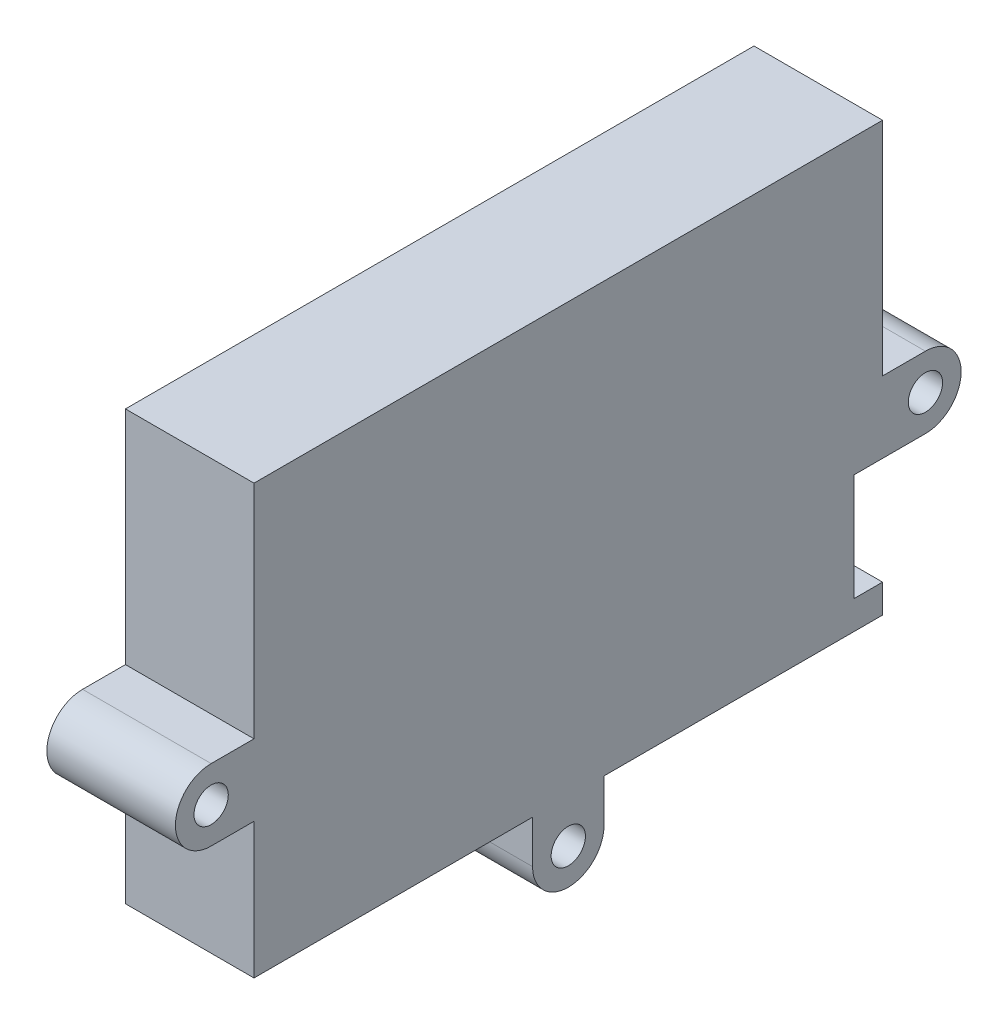
ISO-10303-21;
HEADER;
FILE_DESCRIPTION(('STEP AP214'),'2;1');
FILE_NAME('part.step','',(''),(''),'','','');
FILE_SCHEMA(('AUTOMOTIVE_DESIGN { 1 0 10303 214 1 1 1 1 }'));
ENDSEC;
DATA;
#1=APPLICATION_CONTEXT('core data for automotive mechanical design processes');
#2=APPLICATION_PROTOCOL_DEFINITION('international standard','automotive_design',2000,#1);
#3=PRODUCT_CONTEXT('',#1,'mechanical');
#4=PRODUCT('Part','Part','',(#3));
#5=PRODUCT_RELATED_PRODUCT_CATEGORY('part','',(#4));
#6=PRODUCT_DEFINITION_FORMATION('','',#4);
#7=PRODUCT_DEFINITION_CONTEXT('part definition',#1,'design');
#8=PRODUCT_DEFINITION('design','',#6,#7);
#9=PRODUCT_DEFINITION_SHAPE('','',#8);
#10=(LENGTH_UNIT() NAMED_UNIT(*) SI_UNIT(.MILLI.,.METRE.));
#11=(NAMED_UNIT(*) PLANE_ANGLE_UNIT() SI_UNIT($,.RADIAN.));
#12=(NAMED_UNIT(*) SI_UNIT($,.STERADIAN.) SOLID_ANGLE_UNIT());
#13=UNCERTAINTY_MEASURE_WITH_UNIT(LENGTH_MEASURE(1.E-05),#10,'distance_accuracy_value','');
#14=(GEOMETRIC_REPRESENTATION_CONTEXT(3) GLOBAL_UNCERTAINTY_ASSIGNED_CONTEXT((#13)) GLOBAL_UNIT_ASSIGNED_CONTEXT((#10,
#11,#12)) REPRESENTATION_CONTEXT('',''));
#15=CARTESIAN_POINT('',(0.,0.,0.));
#16=DIRECTION('',(0.,0.,1.));
#17=DIRECTION('',(1.,0.,0.));
#18=AXIS2_PLACEMENT_3D('',#15,#16,#17);
#19=CARTESIAN_POINT('',(-8.89,0.,-53.34));
#20=DIRECTION('',(0.,0.,-1.));
#21=DIRECTION('',(-1.,0.,0.));
#22=AXIS2_PLACEMENT_3D('',#19,#20,#21);
#23=PLANE('',#22);
#24=DIRECTION('',(-1.,0.,0.));
#25=VECTOR('',#24,1.);
#26=CARTESIAN_POINT('',(0.,15.875,-53.34));
#27=LINE('',#26,#25);
#28=CARTESIAN_POINT('',(2.54,15.875,-53.34));
#29=VERTEX_POINT('',#28);
#30=CARTESIAN_POINT('',(-8.89,15.875,-53.34));
#31=VERTEX_POINT('',#30);
#32=EDGE_CURVE('E429',#29,#31,#27,.T.);
#33=ORIENTED_EDGE('',*,*,#32,.T.);
#34=DIRECTION('',(0.,1.,0.));
#35=VECTOR('',#34,1.);
#36=CARTESIAN_POINT('',(-8.89,0.,-53.34));
#37=LINE('',#36,#35);
#38=CARTESIAN_POINT('',(-8.89,35.56,-53.34));
#39=VERTEX_POINT('',#38);
#40=EDGE_CURVE('E215',#31,#39,#37,.T.);
#41=ORIENTED_EDGE('',*,*,#40,.T.);
#42=DIRECTION('',(1.,0.,0.));
#43=VECTOR('',#42,1.);
#44=CARTESIAN_POINT('',(-8.89,35.56,-53.34));
#45=LINE('',#44,#43);
#46=CARTESIAN_POINT('',(2.54,35.56,-53.34));
#47=VERTEX_POINT('',#46);
#48=EDGE_CURVE('E336',#39,#47,#45,.T.);
#49=ORIENTED_EDGE('',*,*,#48,.T.);
#50=DIRECTION('',(0.,1.,0.));
#51=VECTOR('',#50,1.);
#52=CARTESIAN_POINT('',(2.54,0.,-53.34));
#53=LINE('',#52,#51);
#54=EDGE_CURVE('E316',#29,#47,#53,.T.);
#55=ORIENTED_EDGE('',*,*,#54,.F.);
#56=EDGE_LOOP('',(#33,#41,#49,#55));
#57=FACE_BOUND('',#56,.T.);
#58=ADVANCED_FACE('F44',(#57),#23,.T.);
#59=CARTESIAN_POINT('',(-8.89,-2.54,0.));
#60=DIRECTION('',(0.,-1.,0.));
#61=DIRECTION('',(0.,0.,-1.));
#62=AXIS2_PLACEMENT_3D('',#59,#60,#61);
#63=PLANE('',#62);
#64=DIRECTION('',(0.,0.,-1.));
#65=VECTOR('',#64,1.);
#66=CARTESIAN_POINT('',(-8.89,-2.54,0.));
#67=LINE('',#66,#65);
#68=CARTESIAN_POINT('',(-8.89,-2.54,2.54));
#69=VERTEX_POINT('',#68);
#70=CARTESIAN_POINT('',(-8.89,-2.54,-22.225));
#71=VERTEX_POINT('',#70);
#72=EDGE_CURVE('E297',#69,#71,#67,.T.);
#73=ORIENTED_EDGE('',*,*,#72,.T.);
#74=DIRECTION('',(-1.,0.,0.));
#75=VECTOR('',#74,1.);
#76=CARTESIAN_POINT('',(0.,-2.54,-22.225));
#77=LINE('',#76,#75);
#78=CARTESIAN_POINT('',(2.54,-2.54,-22.225));
#79=VERTEX_POINT('',#78);
#80=EDGE_CURVE('E60',#79,#71,#77,.T.);
#81=ORIENTED_EDGE('',*,*,#80,.F.);
#82=DIRECTION('',(0.,0.,-1.));
#83=VECTOR('',#82,1.);
#84=CARTESIAN_POINT('',(2.54,-2.54,0.));
#85=LINE('',#84,#83);
#86=CARTESIAN_POINT('',(2.54,-2.54,2.54));
#87=VERTEX_POINT('',#86);
#88=EDGE_CURVE('E312',#87,#79,#85,.T.);
#89=ORIENTED_EDGE('',*,*,#88,.F.);
#90=DIRECTION('',(1.,0.,0.));
#91=VECTOR('',#90,1.);
#92=CARTESIAN_POINT('',(-8.89,-2.54,2.54));
#93=LINE('',#92,#91);
#94=EDGE_CURVE('E329',#69,#87,#93,.T.);
#95=ORIENTED_EDGE('',*,*,#94,.F.);
#96=EDGE_LOOP('',(#73,#81,#89,#95));
#97=FACE_BOUND('',#96,.T.);
#98=ADVANCED_FACE('F457',(#97),#63,.T.);
#99=DIRECTION('',(-1.,0.,0.));
#100=VECTOR('',#99,1.);
#101=CARTESIAN_POINT('',(0.,-2.54,-28.575));
#102=LINE('',#101,#100);
#103=CARTESIAN_POINT('',(2.54,-2.54,-28.575));
#104=VERTEX_POINT('',#103);
#105=CARTESIAN_POINT('',(-8.89,-2.54,-28.575));
#106=VERTEX_POINT('',#105);
#107=EDGE_CURVE('E53',#104,#106,#102,.T.);
#108=ORIENTED_EDGE('',*,*,#107,.T.);
#109=CARTESIAN_POINT('',(-8.89,-2.54,-53.34));
#110=VERTEX_POINT('',#109);
#111=EDGE_CURVE('E296',#106,#110,#67,.T.);
#112=ORIENTED_EDGE('',*,*,#111,.T.);
#113=DIRECTION('',(1.,0.,0.));
#114=VECTOR('',#113,1.);
#115=CARTESIAN_POINT('',(-8.89,-2.54,-53.34));
#116=LINE('',#115,#114);
#117=CARTESIAN_POINT('',(2.54,-2.54,-53.34));
#118=VERTEX_POINT('',#117);
#119=EDGE_CURVE('E340',#110,#118,#116,.T.);
#120=ORIENTED_EDGE('',*,*,#119,.T.);
#121=EDGE_CURVE('E272',#104,#118,#85,.T.);
#122=ORIENTED_EDGE('',*,*,#121,.F.);
#123=EDGE_LOOP('',(#108,#112,#120,#122));
#124=FACE_BOUND('',#123,.T.);
#125=ADVANCED_FACE('F435',(#124),#63,.T.);
#126=CARTESIAN_POINT('',(-8.89,0.,2.54));
#127=DIRECTION('',(0.,0.,1.));
#128=DIRECTION('',(0.,-1.,0.));
#129=AXIS2_PLACEMENT_3D('',#126,#127,#128);
#130=PLANE('',#129);
#131=DIRECTION('',(0.,-1.,0.));
#132=VECTOR('',#131,1.);
#133=CARTESIAN_POINT('',(-8.89,0.,2.54));
#134=LINE('',#133,#132);
#135=CARTESIAN_POINT('',(-8.89,35.56,2.54));
#136=VERTEX_POINT('',#135);
#137=CARTESIAN_POINT('',(-8.89,15.8749999999999,2.54));
#138=VERTEX_POINT('',#137);
#139=EDGE_CURVE('E308',#136,#138,#134,.T.);
#140=ORIENTED_EDGE('',*,*,#139,.T.);
#141=DIRECTION('',(-1.,0.,0.));
#142=VECTOR('',#141,1.);
#143=CARTESIAN_POINT('',(0.,15.8749999999999,2.54));
#144=LINE('',#143,#142);
#145=CARTESIAN_POINT('',(2.54,15.875,2.54));
#146=VERTEX_POINT('',#145);
#147=EDGE_CURVE('E68',#146,#138,#144,.T.);
#148=ORIENTED_EDGE('',*,*,#147,.F.);
#149=DIRECTION('',(0.,-1.,0.));
#150=VECTOR('',#149,1.);
#151=CARTESIAN_POINT('',(2.54,0.,2.54));
#152=LINE('',#151,#150);
#153=CARTESIAN_POINT('',(2.54,35.56,2.54));
#154=VERTEX_POINT('',#153);
#155=EDGE_CURVE('E286',#154,#146,#152,.T.);
#156=ORIENTED_EDGE('',*,*,#155,.F.);
#157=DIRECTION('',(1.,0.,0.));
#158=VECTOR('',#157,1.);
#159=CARTESIAN_POINT('',(-8.89,35.56,2.54));
#160=LINE('',#159,#158);
#161=EDGE_CURVE('E333',#136,#154,#160,.T.);
#162=ORIENTED_EDGE('',*,*,#161,.F.);
#163=EDGE_LOOP('',(#140,#148,#156,#162));
#164=FACE_BOUND('',#163,.T.);
#165=ADVANCED_FACE('F477',(#164),#130,.T.);
#166=DIRECTION('',(-1.,0.,0.));
#167=VECTOR('',#166,1.);
#168=CARTESIAN_POINT('',(0.,9.52499999999995,2.54));
#169=LINE('',#168,#167);
#170=CARTESIAN_POINT('',(2.54,9.525,2.54));
#171=VERTEX_POINT('',#170);
#172=CARTESIAN_POINT('',(-8.89,9.52499999999995,2.54));
#173=VERTEX_POINT('',#172);
#174=EDGE_CURVE('E11',#171,#173,#169,.T.);
#175=ORIENTED_EDGE('',*,*,#174,.T.);
#176=EDGE_CURVE('E307',#173,#69,#134,.T.);
#177=ORIENTED_EDGE('',*,*,#176,.T.);
#178=ORIENTED_EDGE('',*,*,#94,.T.);
#179=EDGE_CURVE('E325',#171,#87,#152,.T.);
#180=ORIENTED_EDGE('',*,*,#179,.F.);
#181=EDGE_LOOP('',(#175,#177,#178,#180));
#182=FACE_BOUND('',#181,.T.);
#183=ADVANCED_FACE('F534',(#182),#130,.T.);
#184=DIRECTION('',(-1.,0.,0.));
#185=VECTOR('',#184,1.);
#186=CARTESIAN_POINT('',(2.54,0.,-53.34));
#187=LINE('',#186,#185);
#188=CARTESIAN_POINT('',(2.54,0.,-53.34));
#189=VERTEX_POINT('',#188);
#190=CARTESIAN_POINT('',(-8.89,0.,-53.34));
#191=VERTEX_POINT('',#190);
#192=EDGE_CURVE('E273',#189,#191,#187,.T.);
#193=ORIENTED_EDGE('',*,*,#192,.F.);
#194=EDGE_CURVE('E317',#118,#189,#53,.T.);
#195=ORIENTED_EDGE('',*,*,#194,.F.);
#196=ORIENTED_EDGE('',*,*,#119,.F.);
#197=EDGE_CURVE('E300',#110,#191,#37,.T.);
#198=ORIENTED_EDGE('',*,*,#197,.T.);
#199=EDGE_LOOP('',(#193,#195,#196,#198));
#200=FACE_BOUND('',#199,.T.);
#201=ADVANCED_FACE('F512',(#200),#23,.T.);
#202=CARTESIAN_POINT('',(2.54,0.,0.));
#203=DIRECTION('',(-1.,0.,0.));
#204=DIRECTION('',(0.,0.,1.));
#205=AXIS2_PLACEMENT_3D('',#202,#203,#204);
#206=PLANE('',#205);
#207=ORIENTED_EDGE('',*,*,#194,.T.);
#208=DIRECTION('',(0.,0.,1.));
#209=VECTOR('',#208,1.);
#210=CARTESIAN_POINT('',(2.54,0.,-50.8));
#211=LINE('',#210,#209);
#212=CARTESIAN_POINT('',(2.54,0.,-50.8));
#213=VERTEX_POINT('',#212);
#214=EDGE_CURVE('E262',#189,#213,#211,.T.);
#215=ORIENTED_EDGE('',*,*,#214,.T.);
#216=DIRECTION('',(0.,1.,0.));
#217=VECTOR('',#216,1.);
#218=CARTESIAN_POINT('',(2.54,0.,-50.8));
#219=LINE('',#218,#217);
#220=CARTESIAN_POINT('',(2.54,9.52500000000005,-50.8));
#221=VERTEX_POINT('',#220);
#222=EDGE_CURVE('E258',#213,#221,#219,.T.);
#223=ORIENTED_EDGE('',*,*,#222,.T.);
#224=DIRECTION('',(0.,0.,1.));
#225=VECTOR('',#224,1.);
#226=CARTESIAN_POINT('',(2.54,9.52500000000004,0.));
#227=LINE('',#226,#225);
#228=CARTESIAN_POINT('',(2.54,9.52500000000004,-57.15));
#229=VERTEX_POINT('',#228);
#230=EDGE_CURVE('E359',#229,#221,#227,.T.);
#231=ORIENTED_EDGE('',*,*,#230,.F.);
#232=CARTESIAN_POINT('',(2.54,12.7,-57.15));
#233=DIRECTION('',(1.,0.,0.));
#234=DIRECTION('',(0.,0.,-1.));
#235=AXIS2_PLACEMENT_3D('',#232,#233,#234);
#236=CIRCLE('',#235,3.175);
#237=CARTESIAN_POINT('',(2.54,15.875,-57.15));
#238=VERTEX_POINT('',#237);
#239=EDGE_CURVE('E362',#229,#238,#236,.T.);
#240=ORIENTED_EDGE('',*,*,#239,.T.);
#241=DIRECTION('',(0.,0.,1.));
#242=VECTOR('',#241,1.);
#243=CARTESIAN_POINT('',(2.54,15.875,0.));
#244=LINE('',#243,#242);
#245=EDGE_CURVE('E198',#238,#29,#244,.T.);
#246=ORIENTED_EDGE('',*,*,#245,.T.);
#247=ORIENTED_EDGE('',*,*,#54,.T.);
#248=DIRECTION('',(0.,0.,-1.));
#249=VECTOR('',#248,1.);
#250=CARTESIAN_POINT('',(2.54,35.56,0.));
#251=LINE('',#250,#249);
#252=EDGE_CURVE('E321',#154,#47,#251,.T.);
#253=ORIENTED_EDGE('',*,*,#252,.F.);
#254=ORIENTED_EDGE('',*,*,#155,.T.);
#255=DIRECTION('',(0.,0.,-1.));
#256=VECTOR('',#255,1.);
#257=CARTESIAN_POINT('',(2.54,15.875,5.81132364452232E-13));
#258=LINE('',#257,#256);
#259=CARTESIAN_POINT('',(2.54,15.8749999999998,6.34999999999999));
#260=VERTEX_POINT('',#259);
#261=EDGE_CURVE('E391',#260,#146,#258,.T.);
#262=ORIENTED_EDGE('',*,*,#261,.F.);
#263=CARTESIAN_POINT('',(2.54,12.6999999999998,6.34999999999999));
#264=DIRECTION('',(1.,0.,0.));
#265=DIRECTION('',(0.,0.,-1.));
#266=AXIS2_PLACEMENT_3D('',#263,#264,#265);
#267=CIRCLE('',#266,3.175);
#268=CARTESIAN_POINT('',(2.54,9.5249999999998,6.34999999999999));
#269=VERTEX_POINT('',#268);
#270=EDGE_CURVE('E396',#260,#269,#267,.T.);
#271=ORIENTED_EDGE('',*,*,#270,.T.);
#272=DIRECTION('',(0.,0.,-1.));
#273=VECTOR('',#272,1.);
#274=CARTESIAN_POINT('',(2.54,9.52500000000004,3.64291929955132E-13));
#275=LINE('',#274,#273);
#276=EDGE_CURVE('E400',#269,#171,#275,.T.);
#277=ORIENTED_EDGE('',*,*,#276,.T.);
#278=ORIENTED_EDGE('',*,*,#179,.T.);
#279=ORIENTED_EDGE('',*,*,#88,.T.);
#280=DIRECTION('',(0.,1.,0.));
#281=VECTOR('',#280,1.);
#282=CARTESIAN_POINT('',(2.54,0.,-22.225));
#283=LINE('',#282,#281);
#284=CARTESIAN_POINT('',(2.54,-6.34999999999999,-22.225));
#285=VERTEX_POINT('',#284);
#286=EDGE_CURVE('E204',#285,#79,#283,.T.);
#287=ORIENTED_EDGE('',*,*,#286,.F.);
#288=CARTESIAN_POINT('',(2.54,-6.34999999999999,-25.4));
#289=DIRECTION('',(1.,0.,0.));
#290=DIRECTION('',(0.,0.,-1.));
#291=AXIS2_PLACEMENT_3D('',#288,#289,#290);
#292=CIRCLE('',#291,3.175);
#293=CARTESIAN_POINT('',(2.54,-6.34999999999999,-28.575));
#294=VERTEX_POINT('',#293);
#295=EDGE_CURVE('E375',#285,#294,#292,.T.);
#296=ORIENTED_EDGE('',*,*,#295,.T.);
#297=DIRECTION('',(0.,1.,0.));
#298=VECTOR('',#297,1.);
#299=CARTESIAN_POINT('',(2.54,0.,-28.575));
#300=LINE('',#299,#298);
#301=EDGE_CURVE('E379',#294,#104,#300,.T.);
#302=ORIENTED_EDGE('',*,*,#301,.T.);
#303=ORIENTED_EDGE('',*,*,#121,.T.);
#304=EDGE_LOOP('',(#207,#215,#223,#231,#240,#246,#247,#253,#254,#262,#271,#277,#278,#279,#287,
#296,#302,#303));
#305=FACE_BOUND('',#304,.T.);
#306=CARTESIAN_POINT('',(2.54,12.7,-57.15));
#307=DIRECTION('',(1.,0.,0.));
#308=DIRECTION('',(0.,0.,-1.));
#309=AXIS2_PLACEMENT_3D('',#306,#307,#308);
#310=CIRCLE('',#309,1.524);
#311=CARTESIAN_POINT('',(2.54,12.7,-58.674));
#312=VERTEX_POINT('',#311);
#313=EDGE_CURVE('E367',#312,#312,#310,.T.);
#314=ORIENTED_EDGE('',*,*,#313,.F.);
#315=EDGE_LOOP('',(#314));
#316=FACE_BOUND('',#315,.T.);
#317=CARTESIAN_POINT('',(2.54,12.6999999999998,6.34999999999999));
#318=DIRECTION('',(1.,0.,0.));
#319=DIRECTION('',(0.,0.,-1.));
#320=AXIS2_PLACEMENT_3D('',#317,#318,#319);
#321=CIRCLE('',#320,1.524);
#322=CARTESIAN_POINT('',(2.54,12.6999999999998,4.82599999999999));
#323=VERTEX_POINT('',#322);
#324=EDGE_CURVE('E404',#323,#323,#321,.T.);
#325=ORIENTED_EDGE('',*,*,#324,.F.);
#326=EDGE_LOOP('',(#325));
#327=FACE_BOUND('',#326,.T.);
#328=CARTESIAN_POINT('',(2.54,-6.34999999999999,-25.4));
#329=DIRECTION('',(1.,0.,0.));
#330=DIRECTION('',(0.,0.,-1.));
#331=AXIS2_PLACEMENT_3D('',#328,#329,#330);
#332=CIRCLE('',#331,1.524);
#333=CARTESIAN_POINT('',(2.54,-6.34999999999999,-26.924));
#334=VERTEX_POINT('',#333);
#335=EDGE_CURVE('E383',#334,#334,#332,.T.);
#336=ORIENTED_EDGE('',*,*,#335,.F.);
#337=EDGE_LOOP('',(#336));
#338=FACE_BOUND('',#337,.T.);
#339=ADVANCED_FACE('F452',(#305,#316,#327,#338),#206,.F.);
#340=CARTESIAN_POINT('',(0.,15.875,5.81132364452232E-13));
#341=DIRECTION('',(0.,-1.,0.));
#342=DIRECTION('',(0.,0.,-1.));
#343=AXIS2_PLACEMENT_3D('',#340,#341,#342);
#344=PLANE('',#343);
#345=ORIENTED_EDGE('',*,*,#261,.T.);
#346=ORIENTED_EDGE('',*,*,#147,.T.);
#347=DIRECTION('',(0.,0.,1.));
#348=VECTOR('',#347,1.);
#349=CARTESIAN_POINT('',(-8.89,15.8749999999998,6.34999999999999));
#350=LINE('',#349,#348);
#351=CARTESIAN_POINT('',(-8.89,15.8749999999998,6.34999999999999));
#352=VERTEX_POINT('',#351);
#353=EDGE_CURVE('E242',#138,#352,#350,.T.);
#354=ORIENTED_EDGE('',*,*,#353,.T.);
#355=DIRECTION('',(1.,0.,0.));
#356=VECTOR('',#355,1.);
#357=CARTESIAN_POINT('',(0.,15.8749999999998,6.34999999999999));
#358=LINE('',#357,#356);
#359=EDGE_CURVE('E408',#352,#260,#358,.T.);
#360=ORIENTED_EDGE('',*,*,#359,.T.);
#361=EDGE_LOOP('',(#345,#346,#354,#360));
#362=FACE_BOUND('',#361,.T.);
#363=ADVANCED_FACE('F472',(#362),#344,.F.);
#364=CARTESIAN_POINT('',(0.,9.52500000000004,3.64291929955132E-13));
#365=DIRECTION('',(0.,-1.,0.));
#366=DIRECTION('',(0.,0.,-1.));
#367=AXIS2_PLACEMENT_3D('',#364,#365,#366);
#368=PLANE('',#367);
#369=ORIENTED_EDGE('',*,*,#174,.F.);
#370=ORIENTED_EDGE('',*,*,#276,.F.);
#371=DIRECTION('',(1.,0.,0.));
#372=VECTOR('',#371,1.);
#373=CARTESIAN_POINT('',(0.,9.5249999999998,6.34999999999999));
#374=LINE('',#373,#372);
#375=CARTESIAN_POINT('',(-8.89,9.5249999999998,6.34999999999999));
#376=VERTEX_POINT('',#375);
#377=EDGE_CURVE('E409',#376,#269,#374,.T.);
#378=ORIENTED_EDGE('',*,*,#377,.F.);
#379=DIRECTION('',(0.,0.,-1.));
#380=VECTOR('',#379,1.);
#381=CARTESIAN_POINT('',(-8.89,9.52499999999995,2.54));
#382=LINE('',#381,#380);
#383=EDGE_CURVE('E245',#376,#173,#382,.T.);
#384=ORIENTED_EDGE('',*,*,#383,.T.);
#385=EDGE_LOOP('',(#369,#370,#378,#384));
#386=FACE_BOUND('',#385,.T.);
#387=ADVANCED_FACE('F465',(#386),#368,.T.);
#388=CARTESIAN_POINT('',(0.,12.6999999999998,6.34999999999999));
#389=DIRECTION('',(1.,0.,0.));
#390=DIRECTION('',(0.,0.,-1.));
#391=AXIS2_PLACEMENT_3D('',#388,#389,#390);
#392=CYLINDRICAL_SURFACE('',#391,3.175);
#393=ORIENTED_EDGE('',*,*,#270,.F.);
#394=ORIENTED_EDGE('',*,*,#359,.F.);
#395=CARTESIAN_POINT('',(-8.89,12.6999999999998,6.34999999999999));
#396=DIRECTION('',(1.,0.,0.));
#397=DIRECTION('',(0.,0.,-1.));
#398=AXIS2_PLACEMENT_3D('',#395,#396,#397);
#399=CIRCLE('',#398,3.175);
#400=EDGE_CURVE('E249',#352,#376,#399,.T.);
#401=ORIENTED_EDGE('',*,*,#400,.T.);
#402=ORIENTED_EDGE('',*,*,#377,.T.);
#403=EDGE_LOOP('',(#393,#394,#401,#402));
#404=FACE_BOUND('',#403,.T.);
#405=ADVANCED_FACE('F469',(#404),#392,.T.);
#406=CARTESIAN_POINT('',(0.,12.6999999999998,6.34999999999999));
#407=DIRECTION('',(1.,0.,0.));
#408=DIRECTION('',(0.,0.,-1.));
#409=AXIS2_PLACEMENT_3D('',#406,#407,#408);
#410=CYLINDRICAL_SURFACE('',#409,1.524);
#411=ORIENTED_EDGE('',*,*,#324,.T.);
#412=EDGE_LOOP('',(#411));
#413=FACE_BOUND('',#412,.T.);
#414=CARTESIAN_POINT('',(-8.89,12.6999999999998,6.34999999999999));
#415=DIRECTION('',(1.,0.,0.));
#416=DIRECTION('',(0.,0.,-1.));
#417=AXIS2_PLACEMENT_3D('',#414,#415,#416);
#418=CIRCLE('',#417,1.524);
#419=CARTESIAN_POINT('',(-8.89,12.6999999999998,4.826));
#420=VERTEX_POINT('',#419);
#421=EDGE_CURVE('E253',#420,#420,#418,.T.);
#422=ORIENTED_EDGE('',*,*,#421,.F.);
#423=EDGE_LOOP('',(#422));
#424=FACE_BOUND('',#423,.T.);
#425=ADVANCED_FACE('F577',(#413,#424),#410,.F.);
#426=CARTESIAN_POINT('',(0.,0.,-22.225));
#427=DIRECTION('',(0.,0.,-1.));
#428=DIRECTION('',(-1.,0.,0.));
#429=AXIS2_PLACEMENT_3D('',#426,#427,#428);
#430=PLANE('',#429);
#431=ORIENTED_EDGE('',*,*,#286,.T.);
#432=ORIENTED_EDGE('',*,*,#80,.T.);
#433=DIRECTION('',(0.,-1.,0.));
#434=VECTOR('',#433,1.);
#435=CARTESIAN_POINT('',(-8.89,-6.34999999999999,-22.225));
#436=LINE('',#435,#434);
#437=CARTESIAN_POINT('',(-8.89,-6.34999999999999,-22.225));
#438=VERTEX_POINT('',#437);
#439=EDGE_CURVE('E239',#71,#438,#436,.T.);
#440=ORIENTED_EDGE('',*,*,#439,.T.);
#441=DIRECTION('',(1.,0.,0.));
#442=VECTOR('',#441,1.);
#443=CARTESIAN_POINT('',(0.,-6.34999999999999,-22.225));
#444=LINE('',#443,#442);
#445=EDGE_CURVE('E387',#438,#285,#444,.T.);
#446=ORIENTED_EDGE('',*,*,#445,.T.);
#447=EDGE_LOOP('',(#431,#432,#440,#446));
#448=FACE_BOUND('',#447,.T.);
#449=ADVANCED_FACE('F449',(#448),#430,.F.);
#450=CARTESIAN_POINT('',(0.,0.,-28.575));
#451=DIRECTION('',(0.,0.,-1.));
#452=DIRECTION('',(-1.,0.,0.));
#453=AXIS2_PLACEMENT_3D('',#450,#451,#452);
#454=PLANE('',#453);
#455=ORIENTED_EDGE('',*,*,#107,.F.);
#456=ORIENTED_EDGE('',*,*,#301,.F.);
#457=DIRECTION('',(1.,0.,0.));
#458=VECTOR('',#457,1.);
#459=CARTESIAN_POINT('',(0.,-6.34999999999999,-28.575));
#460=LINE('',#459,#458);
#461=CARTESIAN_POINT('',(-8.89,-6.34999999999999,-28.575));
#462=VERTEX_POINT('',#461);
#463=EDGE_CURVE('E388',#462,#294,#460,.T.);
#464=ORIENTED_EDGE('',*,*,#463,.F.);
#465=DIRECTION('',(0.,1.,0.));
#466=VECTOR('',#465,1.);
#467=CARTESIAN_POINT('',(-8.89,-2.54,-28.575));
#468=LINE('',#467,#466);
#469=EDGE_CURVE('E235',#462,#106,#468,.T.);
#470=ORIENTED_EDGE('',*,*,#469,.T.);
#471=EDGE_LOOP('',(#455,#456,#464,#470));
#472=FACE_BOUND('',#471,.T.);
#473=ADVANCED_FACE('F443',(#472),#454,.T.);
#474=CARTESIAN_POINT('',(0.,-6.34999999999999,-25.4));
#475=DIRECTION('',(1.,0.,0.));
#476=DIRECTION('',(0.,0.,-1.));
#477=AXIS2_PLACEMENT_3D('',#474,#475,#476);
#478=CYLINDRICAL_SURFACE('',#477,3.175);
#479=ORIENTED_EDGE('',*,*,#295,.F.);
#480=ORIENTED_EDGE('',*,*,#445,.F.);
#481=CARTESIAN_POINT('',(-8.89,-6.34999999999999,-25.4));
#482=DIRECTION('',(1.,0.,0.));
#483=DIRECTION('',(0.,0.,-1.));
#484=AXIS2_PLACEMENT_3D('',#481,#482,#483);
#485=CIRCLE('',#484,3.175);
#486=EDGE_CURVE('E231',#438,#462,#485,.T.);
#487=ORIENTED_EDGE('',*,*,#486,.T.);
#488=ORIENTED_EDGE('',*,*,#463,.T.);
#489=EDGE_LOOP('',(#479,#480,#487,#488));
#490=FACE_BOUND('',#489,.T.);
#491=ADVANCED_FACE('F446',(#490),#478,.T.);
#492=CARTESIAN_POINT('',(0.,-6.34999999999999,-25.4));
#493=DIRECTION('',(1.,0.,0.));
#494=DIRECTION('',(0.,0.,-1.));
#495=AXIS2_PLACEMENT_3D('',#492,#493,#494);
#496=CYLINDRICAL_SURFACE('',#495,1.524);
#497=ORIENTED_EDGE('',*,*,#335,.T.);
#498=EDGE_LOOP('',(#497));
#499=FACE_BOUND('',#498,.T.);
#500=CARTESIAN_POINT('',(-8.89,-6.34999999999999,-25.4));
#501=DIRECTION('',(1.,0.,0.));
#502=DIRECTION('',(0.,0.,-1.));
#503=AXIS2_PLACEMENT_3D('',#500,#501,#502);
#504=CIRCLE('',#503,1.524);
#505=CARTESIAN_POINT('',(-8.89,-6.34999999999999,-26.924));
#506=VERTEX_POINT('',#505);
#507=EDGE_CURVE('E217',#506,#506,#504,.T.);
#508=ORIENTED_EDGE('',*,*,#507,.F.);
#509=EDGE_LOOP('',(#508));
#510=FACE_BOUND('',#509,.T.);
#511=ADVANCED_FACE('F567',(#499,#510),#496,.F.);
#512=CARTESIAN_POINT('',(0.,9.52500000000004,0.));
#513=DIRECTION('',(0.,1.,0.));
#514=DIRECTION('',(0.,0.,1.));
#515=AXIS2_PLACEMENT_3D('',#512,#513,#514);
#516=PLANE('',#515);
#517=ORIENTED_EDGE('',*,*,#230,.T.);
#518=DIRECTION('',(-1.,0.,0.));
#519=VECTOR('',#518,1.);
#520=CARTESIAN_POINT('',(2.54,9.52500000000005,-50.8));
#521=LINE('',#520,#519);
#522=CARTESIAN_POINT('',(0.,9.52500000000005,-50.8));
#523=VERTEX_POINT('',#522);
#524=EDGE_CURVE('E277',#221,#523,#521,.T.);
#525=ORIENTED_EDGE('',*,*,#524,.T.);
#526=CARTESIAN_POINT('',(-8.89,9.52500000000005,-50.8));
#527=VERTEX_POINT('',#526);
#528=EDGE_CURVE('E266',#523,#527,#521,.T.);
#529=ORIENTED_EDGE('',*,*,#528,.T.);
#530=DIRECTION('',(0.,0.,-1.));
#531=VECTOR('',#530,1.);
#532=CARTESIAN_POINT('',(-8.89,9.52500000000005,-50.8));
#533=LINE('',#532,#531);
#534=CARTESIAN_POINT('',(-8.89,9.52500000000004,-57.15));
#535=VERTEX_POINT('',#534);
#536=EDGE_CURVE('E257',#527,#535,#533,.T.);
#537=ORIENTED_EDGE('',*,*,#536,.T.);
#538=DIRECTION('',(1.,0.,0.));
#539=VECTOR('',#538,1.);
#540=CARTESIAN_POINT('',(0.,9.52500000000004,-57.15));
#541=LINE('',#540,#539);
#542=EDGE_CURVE('E205',#535,#229,#541,.T.);
#543=ORIENTED_EDGE('',*,*,#542,.T.);
#544=EDGE_LOOP('',(#517,#525,#529,#537,#543));
#545=FACE_BOUND('',#544,.T.);
#546=ADVANCED_FACE('F490',(#545),#516,.F.);
#547=CARTESIAN_POINT('',(0.,15.875,0.));
#548=DIRECTION('',(0.,1.,0.));
#549=DIRECTION('',(0.,0.,1.));
#550=AXIS2_PLACEMENT_3D('',#547,#548,#549);
#551=PLANE('',#550);
#552=ORIENTED_EDGE('',*,*,#32,.F.);
#553=ORIENTED_EDGE('',*,*,#245,.F.);
#554=DIRECTION('',(1.,0.,0.));
#555=VECTOR('',#554,1.);
#556=CARTESIAN_POINT('',(0.,15.875,-57.15));
#557=LINE('',#556,#555);
#558=CARTESIAN_POINT('',(-8.89,15.875,-57.15));
#559=VERTEX_POINT('',#558);
#560=EDGE_CURVE('E192',#559,#238,#557,.T.);
#561=ORIENTED_EDGE('',*,*,#560,.F.);
#562=DIRECTION('',(0.,0.,1.));
#563=VECTOR('',#562,1.);
#564=CARTESIAN_POINT('',(-8.89,15.875,-57.15));
#565=LINE('',#564,#563);
#566=EDGE_CURVE('E196',#559,#31,#565,.T.);
#567=ORIENTED_EDGE('',*,*,#566,.T.);
#568=EDGE_LOOP('',(#552,#553,#561,#567));
#569=FACE_BOUND('',#568,.T.);
#570=ADVANCED_FACE('F195',(#569),#551,.T.);
#571=CARTESIAN_POINT('',(0.,12.7,-57.15));
#572=DIRECTION('',(1.,0.,0.));
#573=DIRECTION('',(0.,0.,-1.));
#574=AXIS2_PLACEMENT_3D('',#571,#572,#573);
#575=CYLINDRICAL_SURFACE('',#574,3.175);
#576=ORIENTED_EDGE('',*,*,#239,.F.);
#577=ORIENTED_EDGE('',*,*,#542,.F.);
#578=CARTESIAN_POINT('',(-8.89,12.7,-57.15));
#579=DIRECTION('',(1.,0.,0.));
#580=DIRECTION('',(0.,0.,-1.));
#581=AXIS2_PLACEMENT_3D('',#578,#579,#580);
#582=CIRCLE('',#581,3.175);
#583=EDGE_CURVE('E213',#535,#559,#582,.T.);
#584=ORIENTED_EDGE('',*,*,#583,.T.);
#585=ORIENTED_EDGE('',*,*,#560,.T.);
#586=EDGE_LOOP('',(#576,#577,#584,#585));
#587=FACE_BOUND('',#586,.T.);
#588=ADVANCED_FACE('F219',(#587),#575,.T.);
#589=CARTESIAN_POINT('',(0.,12.7,-57.15));
#590=DIRECTION('',(1.,0.,0.));
#591=DIRECTION('',(0.,0.,-1.));
#592=AXIS2_PLACEMENT_3D('',#589,#590,#591);
#593=CYLINDRICAL_SURFACE('',#592,1.524);
#594=ORIENTED_EDGE('',*,*,#313,.T.);
#595=EDGE_LOOP('',(#594));
#596=FACE_BOUND('',#595,.T.);
#597=CARTESIAN_POINT('',(-8.89,12.7,-57.15));
#598=DIRECTION('',(1.,0.,0.));
#599=DIRECTION('',(0.,0.,-1.));
#600=AXIS2_PLACEMENT_3D('',#597,#598,#599);
#601=CIRCLE('',#600,1.524);
#602=CARTESIAN_POINT('',(-8.89,12.7,-58.674));
#603=VERTEX_POINT('',#602);
#604=EDGE_CURVE('E222',#603,#603,#601,.T.);
#605=ORIENTED_EDGE('',*,*,#604,.F.);
#606=EDGE_LOOP('',(#605));
#607=FACE_BOUND('',#606,.T.);
#608=ADVANCED_FACE('F557',(#596,#607),#593,.F.);
#609=CARTESIAN_POINT('',(-8.89,0.,0.));
#610=DIRECTION('',(0.,0.,1.));
#611=DIRECTION('',(1.,0.,0.));
#612=AXIS2_PLACEMENT_3D('',#609,#610,#611);
#613=PLANE('',#612);
#614=DIRECTION('',(0.,-1.,0.));
#615=VECTOR('',#614,1.);
#616=CARTESIAN_POINT('',(0.,0.,0.));
#617=LINE('',#616,#615);
#618=CARTESIAN_POINT('',(0.,33.02,0.));
#619=VERTEX_POINT('',#618);
#620=CARTESIAN_POINT('',(0.,0.,0.));
#621=VERTEX_POINT('',#620);
#622=EDGE_CURVE('E412',#619,#621,#617,.T.);
#623=ORIENTED_EDGE('',*,*,#622,.T.);
#624=DIRECTION('',(1.,0.,0.));
#625=VECTOR('',#624,1.);
#626=CARTESIAN_POINT('',(-8.89,0.,0.));
#627=LINE('',#626,#625);
#628=CARTESIAN_POINT('',(-8.89,0.,0.));
#629=VERTEX_POINT('',#628);
#630=EDGE_CURVE('E344',#629,#621,#627,.T.);
#631=ORIENTED_EDGE('',*,*,#630,.F.);
#632=DIRECTION('',(0.,-1.,0.));
#633=VECTOR('',#632,1.);
#634=CARTESIAN_POINT('',(-8.89,0.,0.));
#635=LINE('',#634,#633);
#636=CARTESIAN_POINT('',(-8.89,33.02,0.));
#637=VERTEX_POINT('',#636);
#638=EDGE_CURVE('E281',#637,#629,#635,.T.);
#639=ORIENTED_EDGE('',*,*,#638,.F.);
#640=DIRECTION('',(1.,0.,0.));
#641=VECTOR('',#640,1.);
#642=CARTESIAN_POINT('',(-8.89,33.02,0.));
#643=LINE('',#642,#641);
#644=EDGE_CURVE('E311',#637,#619,#643,.T.);
#645=ORIENTED_EDGE('',*,*,#644,.T.);
#646=EDGE_LOOP('',(#623,#631,#639,#645));
#647=FACE_BOUND('',#646,.T.);
#648=ADVANCED_FACE('F504',(#647),#613,.F.);
#649=CARTESIAN_POINT('',(-8.89,0.,0.));
#650=DIRECTION('',(0.,-1.,0.));
#651=DIRECTION('',(0.,0.,-1.));
#652=AXIS2_PLACEMENT_3D('',#649,#650,#651);
#653=PLANE('',#652);
#654=DIRECTION('',(0.,0.,-1.));
#655=VECTOR('',#654,1.);
#656=CARTESIAN_POINT('',(0.,0.,0.));
#657=LINE('',#656,#655);
#658=CARTESIAN_POINT('',(0.,0.,-50.8));
#659=VERTEX_POINT('',#658);
#660=EDGE_CURVE('E417',#621,#659,#657,.T.);
#661=ORIENTED_EDGE('',*,*,#660,.T.);
#662=DIRECTION('',(-1.,0.,0.));
#663=VECTOR('',#662,1.);
#664=CARTESIAN_POINT('',(2.54,0.,-50.8));
#665=LINE('',#664,#663);
#666=EDGE_CURVE('E269',#213,#659,#665,.T.);
#667=ORIENTED_EDGE('',*,*,#666,.F.);
#668=ORIENTED_EDGE('',*,*,#214,.F.);
#669=ORIENTED_EDGE('',*,*,#192,.T.);
#670=DIRECTION('',(0.,0.,-1.));
#671=VECTOR('',#670,1.);
#672=CARTESIAN_POINT('',(-8.89,0.,0.));
#673=LINE('',#672,#671);
#674=EDGE_CURVE('E293',#629,#191,#673,.T.);
#675=ORIENTED_EDGE('',*,*,#674,.F.);
#676=ORIENTED_EDGE('',*,*,#630,.T.);
#677=EDGE_LOOP('',(#661,#667,#668,#669,#675,#676));
#678=FACE_BOUND('',#677,.T.);
#679=ADVANCED_FACE('F507',(#678),#653,.F.);
#680=CARTESIAN_POINT('',(-8.89,0.,-50.8));
#681=DIRECTION('',(0.,0.,-1.));
#682=DIRECTION('',(-1.,0.,0.));
#683=AXIS2_PLACEMENT_3D('',#680,#681,#682);
#684=PLANE('',#683);
#685=DIRECTION('',(0.,1.,0.));
#686=VECTOR('',#685,1.);
#687=CARTESIAN_POINT('',(-8.89,0.,-50.8));
#688=LINE('',#687,#686);
#689=CARTESIAN_POINT('',(-8.89,33.02,-50.8));
#690=VERTEX_POINT('',#689);
#691=EDGE_CURVE('E290',#527,#690,#688,.T.);
#692=ORIENTED_EDGE('',*,*,#691,.F.);
#693=ORIENTED_EDGE('',*,*,#528,.F.);
#694=DIRECTION('',(0.,1.,0.));
#695=VECTOR('',#694,1.);
#696=CARTESIAN_POINT('',(0.,0.,-50.8));
#697=LINE('',#696,#695);
#698=CARTESIAN_POINT('',(0.,33.02,-50.8));
#699=VERTEX_POINT('',#698);
#700=EDGE_CURVE('E421',#523,#699,#697,.T.);
#701=ORIENTED_EDGE('',*,*,#700,.T.);
#702=DIRECTION('',(1.,0.,0.));
#703=VECTOR('',#702,1.);
#704=CARTESIAN_POINT('',(-8.89,33.02,-50.8));
#705=LINE('',#704,#703);
#706=EDGE_CURVE('E348',#690,#699,#705,.T.);
#707=ORIENTED_EDGE('',*,*,#706,.F.);
#708=EDGE_LOOP('',(#692,#693,#701,#707));
#709=FACE_BOUND('',#708,.T.);
#710=ADVANCED_FACE('F497',(#709),#684,.F.);
#711=CARTESIAN_POINT('',(-8.89,35.56,0.));
#712=DIRECTION('',(0.,-1.,0.));
#713=DIRECTION('',(0.,0.,-1.));
#714=AXIS2_PLACEMENT_3D('',#711,#712,#713);
#715=PLANE('',#714);
#716=ORIENTED_EDGE('',*,*,#252,.T.);
#717=ORIENTED_EDGE('',*,*,#48,.F.);
#718=DIRECTION('',(0.,0.,-1.));
#719=VECTOR('',#718,1.);
#720=CARTESIAN_POINT('',(-8.89,35.56,0.));
#721=LINE('',#720,#719);
#722=EDGE_CURVE('E304',#136,#39,#721,.T.);
#723=ORIENTED_EDGE('',*,*,#722,.F.);
#724=ORIENTED_EDGE('',*,*,#161,.T.);
#725=EDGE_LOOP('',(#716,#717,#723,#724));
#726=FACE_BOUND('',#725,.T.);
#727=ADVANCED_FACE('F481',(#726),#715,.F.);
#728=CARTESIAN_POINT('',(-8.89,33.02,0.));
#729=DIRECTION('',(0.,-1.,0.));
#730=DIRECTION('',(0.,0.,-1.));
#731=AXIS2_PLACEMENT_3D('',#728,#729,#730);
#732=PLANE('',#731);
#733=ORIENTED_EDGE('',*,*,#706,.T.);
#734=DIRECTION('',(0.,0.,1.));
#735=VECTOR('',#734,1.);
#736=CARTESIAN_POINT('',(0.,33.02,0.));
#737=LINE('',#736,#735);
#738=EDGE_CURVE('E425',#699,#619,#737,.T.);
#739=ORIENTED_EDGE('',*,*,#738,.T.);
#740=ORIENTED_EDGE('',*,*,#644,.F.);
#741=DIRECTION('',(0.,0.,-1.));
#742=VECTOR('',#741,1.);
#743=CARTESIAN_POINT('',(-8.89,33.02,0.));
#744=LINE('',#743,#742);
#745=EDGE_CURVE('E285',#637,#690,#744,.T.);
#746=ORIENTED_EDGE('',*,*,#745,.T.);
#747=EDGE_LOOP('',(#733,#739,#740,#746));
#748=FACE_BOUND('',#747,.T.);
#749=ADVANCED_FACE('F500',(#748),#732,.T.);
#750=CARTESIAN_POINT('',(-8.89,0.,0.));
#751=DIRECTION('',(1.,0.,0.));
#752=DIRECTION('',(0.,0.,-1.));
#753=AXIS2_PLACEMENT_3D('',#750,#751,#752);
#754=PLANE('',#753);
#755=ORIENTED_EDGE('',*,*,#674,.T.);
#756=ORIENTED_EDGE('',*,*,#197,.F.);
#757=ORIENTED_EDGE('',*,*,#111,.F.);
#758=ORIENTED_EDGE('',*,*,#469,.F.);
#759=ORIENTED_EDGE('',*,*,#486,.F.);
#760=ORIENTED_EDGE('',*,*,#439,.F.);
#761=ORIENTED_EDGE('',*,*,#72,.F.);
#762=ORIENTED_EDGE('',*,*,#176,.F.);
#763=ORIENTED_EDGE('',*,*,#383,.F.);
#764=ORIENTED_EDGE('',*,*,#400,.F.);
#765=ORIENTED_EDGE('',*,*,#353,.F.);
#766=ORIENTED_EDGE('',*,*,#139,.F.);
#767=ORIENTED_EDGE('',*,*,#722,.T.);
#768=ORIENTED_EDGE('',*,*,#40,.F.);
#769=ORIENTED_EDGE('',*,*,#566,.F.);
#770=ORIENTED_EDGE('',*,*,#583,.F.);
#771=ORIENTED_EDGE('',*,*,#536,.F.);
#772=ORIENTED_EDGE('',*,*,#691,.T.);
#773=ORIENTED_EDGE('',*,*,#745,.F.);
#774=ORIENTED_EDGE('',*,*,#638,.T.);
#775=EDGE_LOOP('',(#755,#756,#757,#758,#759,#760,#761,#762,#763,#764,#765,#766,#767,#768,#769,
#770,#771,#772,#773,#774));
#776=FACE_BOUND('',#775,.T.);
#777=ORIENTED_EDGE('',*,*,#421,.T.);
#778=EDGE_LOOP('',(#777));
#779=FACE_BOUND('',#778,.T.);
#780=ORIENTED_EDGE('',*,*,#507,.T.);
#781=EDGE_LOOP('',(#780));
#782=FACE_BOUND('',#781,.T.);
#783=ORIENTED_EDGE('',*,*,#604,.T.);
#784=EDGE_LOOP('',(#783));
#785=FACE_BOUND('',#784,.T.);
#786=ADVANCED_FACE('F210',(#776,#779,#782,#785),#754,.F.);
#787=CARTESIAN_POINT('',(0.,0.,0.));
#788=DIRECTION('',(-1.,0.,0.));
#789=DIRECTION('',(0.,0.,1.));
#790=AXIS2_PLACEMENT_3D('',#787,#788,#789);
#791=PLANE('',#790);
#792=ORIENTED_EDGE('',*,*,#660,.F.);
#793=ORIENTED_EDGE('',*,*,#622,.F.);
#794=ORIENTED_EDGE('',*,*,#738,.F.);
#795=ORIENTED_EDGE('',*,*,#700,.F.);
#796=EDGE_CURVE('E422',#659,#523,#697,.T.);
#797=ORIENTED_EDGE('',*,*,#796,.F.);
#798=EDGE_LOOP('',(#792,#793,#794,#795,#797));
#799=FACE_BOUND('',#798,.T.);
#800=ADVANCED_FACE('F46',(#799),#791,.T.);
#801=CARTESIAN_POINT('',(2.54,0.,-50.8));
#802=DIRECTION('',(0.,0.,1.));
#803=DIRECTION('',(1.,0.,0.));
#804=AXIS2_PLACEMENT_3D('',#801,#802,#803);
#805=PLANE('',#804);
#806=ORIENTED_EDGE('',*,*,#796,.T.);
#807=ORIENTED_EDGE('',*,*,#524,.F.);
#808=ORIENTED_EDGE('',*,*,#222,.F.);
#809=ORIENTED_EDGE('',*,*,#666,.T.);
#810=EDGE_LOOP('',(#806,#807,#808,#809));
#811=FACE_BOUND('',#810,.T.);
#812=ADVANCED_FACE('F516',(#811),#805,.F.);
#813=CLOSED_SHELL('',(#58,#98,#125,#165,#183,#201,#339,#363,#387,#405,#425,#449,#473,#491,#511,
#546,#570,#588,#608,#648,#679,#710,#727,#749,#786,#800,#812));
#814=MANIFOLD_SOLID_BREP('B2',#813);
#815=ADVANCED_BREP_SHAPE_REPRESENTATION('',(#18,#814),#14);
#816=SHAPE_DEFINITION_REPRESENTATION(#9,#815);
ENDSEC;
END-ISO-10303-21;
